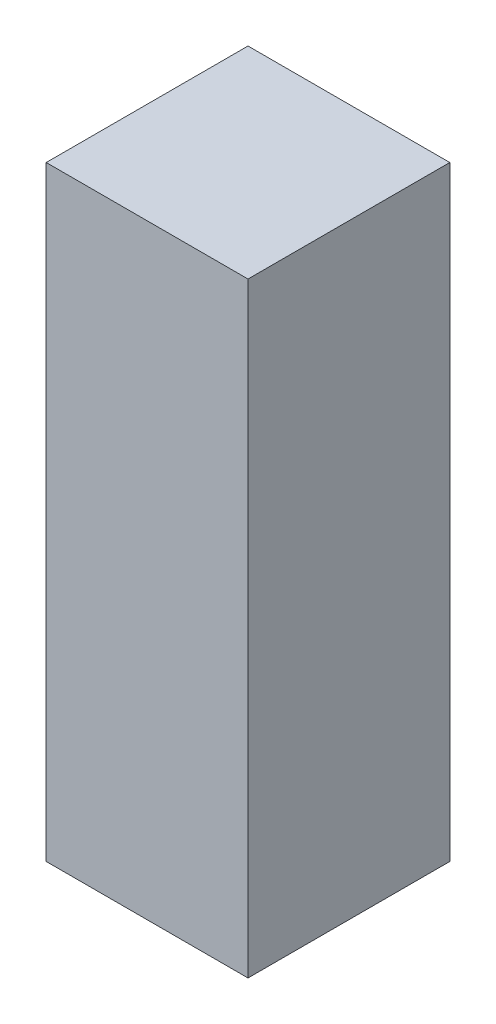
ISO-10303-21;
HEADER;
FILE_DESCRIPTION(('STEP AP214'),'2;1');
FILE_NAME('part.step','',(''),(''),'','','');
FILE_SCHEMA(('AUTOMOTIVE_DESIGN { 1 0 10303 214 1 1 1 1 }'));
ENDSEC;
DATA;
#1=APPLICATION_CONTEXT('core data for automotive mechanical design processes');
#2=APPLICATION_PROTOCOL_DEFINITION('international standard','automotive_design',2000,#1);
#3=PRODUCT_CONTEXT('',#1,'mechanical');
#4=PRODUCT('Part','Part','',(#3));
#5=PRODUCT_RELATED_PRODUCT_CATEGORY('part','',(#4));
#6=PRODUCT_DEFINITION_FORMATION('','',#4);
#7=PRODUCT_DEFINITION_CONTEXT('part definition',#1,'design');
#8=PRODUCT_DEFINITION('design','',#6,#7);
#9=PRODUCT_DEFINITION_SHAPE('','',#8);
#10=(LENGTH_UNIT() NAMED_UNIT(*) SI_UNIT(.MILLI.,.METRE.));
#11=(NAMED_UNIT(*) PLANE_ANGLE_UNIT() SI_UNIT($,.RADIAN.));
#12=(NAMED_UNIT(*) SI_UNIT($,.STERADIAN.) SOLID_ANGLE_UNIT());
#13=UNCERTAINTY_MEASURE_WITH_UNIT(LENGTH_MEASURE(1.E-05),#10,'distance_accuracy_value','');
#14=(GEOMETRIC_REPRESENTATION_CONTEXT(3) GLOBAL_UNCERTAINTY_ASSIGNED_CONTEXT((#13)) GLOBAL_UNIT_ASSIGNED_CONTEXT((#10,
#11,#12)) REPRESENTATION_CONTEXT('',''));
#15=CARTESIAN_POINT('',(0.,0.,0.));
#16=DIRECTION('',(0.,0.,1.));
#17=DIRECTION('',(1.,0.,0.));
#18=AXIS2_PLACEMENT_3D('',#15,#16,#17);
#19=CARTESIAN_POINT('',(-0.914015151515154,9.525,-1.13049242424243));
#20=DIRECTION('',(1.,0.,0.));
#21=DIRECTION('',(0.,0.,-1.));
#22=AXIS2_PLACEMENT_3D('',#19,#20,#21);
#23=PLANE('',#22);
#24=DIRECTION('',(0.,0.,1.));
#25=VECTOR('',#24,1.);
#26=CARTESIAN_POINT('',(-0.914015151515154,0.,-1.13049242424243));
#27=LINE('',#26,#25);
#28=CARTESIAN_POINT('',(-0.914015151515154,0.,-1.13049242424243));
#29=VERTEX_POINT('',#28);
#30=CARTESIAN_POINT('',(-0.914015151515154,0.,2.04450757575757));
#31=VERTEX_POINT('',#30);
#32=EDGE_CURVE('E97',#29,#31,#27,.T.);
#33=ORIENTED_EDGE('',*,*,#32,.T.);
#34=DIRECTION('',(0.,-1.,0.));
#35=VECTOR('',#34,1.);
#36=CARTESIAN_POINT('',(-0.914015151515154,9.525,2.04450757575757));
#37=LINE('',#36,#35);
#38=CARTESIAN_POINT('',(-0.914015151515154,9.525,2.04450757575757));
#39=VERTEX_POINT('',#38);
#40=EDGE_CURVE('E11',#39,#31,#37,.T.);
#41=ORIENTED_EDGE('',*,*,#40,.F.);
#42=DIRECTION('',(0.,0.,1.));
#43=VECTOR('',#42,1.);
#44=CARTESIAN_POINT('',(-0.914015151515154,9.525,-1.13049242424243));
#45=LINE('',#44,#43);
#46=CARTESIAN_POINT('',(-0.914015151515154,9.525,-1.13049242424243));
#47=VERTEX_POINT('',#46);
#48=EDGE_CURVE('E85',#47,#39,#45,.T.);
#49=ORIENTED_EDGE('',*,*,#48,.F.);
#50=DIRECTION('',(0.,-1.,0.));
#51=VECTOR('',#50,1.);
#52=CARTESIAN_POINT('',(-0.914015151515154,9.525,-1.13049242424243));
#53=LINE('',#52,#51);
#54=EDGE_CURVE('E93',#47,#29,#53,.T.);
#55=ORIENTED_EDGE('',*,*,#54,.T.);
#56=EDGE_LOOP('',(#33,#41,#49,#55));
#57=FACE_BOUND('',#56,.T.);
#58=ADVANCED_FACE('F34',(#57),#23,.F.);
#59=CARTESIAN_POINT('',(-0.914015151515154,9.525,2.04450757575757));
#60=DIRECTION('',(0.,0.,-1.));
#61=DIRECTION('',(-1.,0.,0.));
#62=AXIS2_PLACEMENT_3D('',#59,#60,#61);
#63=PLANE('',#62);
#64=DIRECTION('',(1.,0.,0.));
#65=VECTOR('',#64,1.);
#66=CARTESIAN_POINT('',(-0.914015151515154,0.,2.04450757575757));
#67=LINE('',#66,#65);
#68=CARTESIAN_POINT('',(2.26098484848485,0.,2.04450757575757));
#69=VERTEX_POINT('',#68);
#70=EDGE_CURVE('E89',#31,#69,#67,.T.);
#71=ORIENTED_EDGE('',*,*,#70,.T.);
#72=DIRECTION('',(0.,-1.,0.));
#73=VECTOR('',#72,1.);
#74=CARTESIAN_POINT('',(2.26098484848485,9.525,2.04450757575757));
#75=LINE('',#74,#73);
#76=CARTESIAN_POINT('',(2.26098484848485,9.525,2.04450757575757));
#77=VERTEX_POINT('',#76);
#78=EDGE_CURVE('E42',#77,#69,#75,.T.);
#79=ORIENTED_EDGE('',*,*,#78,.F.);
#80=DIRECTION('',(1.,0.,0.));
#81=VECTOR('',#80,1.);
#82=CARTESIAN_POINT('',(-0.914015151515154,9.525,2.04450757575757));
#83=LINE('',#82,#81);
#84=EDGE_CURVE('E80',#39,#77,#83,.T.);
#85=ORIENTED_EDGE('',*,*,#84,.F.);
#86=ORIENTED_EDGE('',*,*,#40,.T.);
#87=EDGE_LOOP('',(#71,#79,#85,#86));
#88=FACE_BOUND('',#87,.T.);
#89=ADVANCED_FACE('F88',(#88),#63,.F.);
#90=CARTESIAN_POINT('',(2.26098484848485,9.525,-1.13049242424243));
#91=DIRECTION('',(-1.,0.,0.));
#92=DIRECTION('',(0.,0.,1.));
#93=AXIS2_PLACEMENT_3D('',#90,#91,#92);
#94=PLANE('',#93);
#95=DIRECTION('',(0.,0.,-1.));
#96=VECTOR('',#95,1.);
#97=CARTESIAN_POINT('',(2.26098484848485,0.,-1.13049242424243));
#98=LINE('',#97,#96);
#99=CARTESIAN_POINT('',(2.26098484848485,0.,-1.13049242424243));
#100=VERTEX_POINT('',#99);
#101=EDGE_CURVE('E67',#69,#100,#98,.T.);
#102=ORIENTED_EDGE('',*,*,#101,.T.);
#103=DIRECTION('',(0.,-1.,0.));
#104=VECTOR('',#103,1.);
#105=CARTESIAN_POINT('',(2.26098484848485,9.525,-1.13049242424243));
#106=LINE('',#105,#104);
#107=CARTESIAN_POINT('',(2.26098484848485,9.525,-1.13049242424243));
#108=VERTEX_POINT('',#107);
#109=EDGE_CURVE('E90',#108,#100,#106,.T.);
#110=ORIENTED_EDGE('',*,*,#109,.F.);
#111=DIRECTION('',(0.,0.,-1.));
#112=VECTOR('',#111,1.);
#113=CARTESIAN_POINT('',(2.26098484848485,9.525,-1.13049242424243));
#114=LINE('',#113,#112);
#115=EDGE_CURVE('E83',#77,#108,#114,.T.);
#116=ORIENTED_EDGE('',*,*,#115,.F.);
#117=ORIENTED_EDGE('',*,*,#78,.T.);
#118=EDGE_LOOP('',(#102,#110,#116,#117));
#119=FACE_BOUND('',#118,.T.);
#120=ADVANCED_FACE('F91',(#119),#94,.F.);
#121=CARTESIAN_POINT('',(-0.914015151515154,9.525,-1.13049242424243));
#122=DIRECTION('',(0.,0.,1.));
#123=DIRECTION('',(1.,0.,0.));
#124=AXIS2_PLACEMENT_3D('',#121,#122,#123);
#125=PLANE('',#124);
#126=DIRECTION('',(-1.,0.,0.));
#127=VECTOR('',#126,1.);
#128=CARTESIAN_POINT('',(-0.914015151515154,0.,-1.13049242424243));
#129=LINE('',#128,#127);
#130=EDGE_CURVE('E73',#100,#29,#129,.T.);
#131=ORIENTED_EDGE('',*,*,#130,.T.);
#132=ORIENTED_EDGE('',*,*,#54,.F.);
#133=DIRECTION('',(-1.,0.,0.));
#134=VECTOR('',#133,1.);
#135=CARTESIAN_POINT('',(-0.914015151515154,9.525,-1.13049242424243));
#136=LINE('',#135,#134);
#137=EDGE_CURVE('E50',#108,#47,#136,.T.);
#138=ORIENTED_EDGE('',*,*,#137,.F.);
#139=ORIENTED_EDGE('',*,*,#109,.T.);
#140=EDGE_LOOP('',(#131,#132,#138,#139));
#141=FACE_BOUND('',#140,.T.);
#142=ADVANCED_FACE('F104',(#141),#125,.F.);
#143=CARTESIAN_POINT('',(0.,9.525,0.));
#144=DIRECTION('',(0.,1.,0.));
#145=DIRECTION('',(0.,0.,1.));
#146=AXIS2_PLACEMENT_3D('',#143,#144,#145);
#147=PLANE('',#146);
#148=ORIENTED_EDGE('',*,*,#48,.T.);
#149=ORIENTED_EDGE('',*,*,#84,.T.);
#150=ORIENTED_EDGE('',*,*,#115,.T.);
#151=ORIENTED_EDGE('',*,*,#137,.T.);
#152=EDGE_LOOP('',(#148,#149,#150,#151));
#153=FACE_BOUND('',#152,.T.);
#154=ADVANCED_FACE('F81',(#153),#147,.T.);
#155=CARTESIAN_POINT('',(0.,0.,0.));
#156=DIRECTION('',(0.,1.,0.));
#157=DIRECTION('',(0.,0.,1.));
#158=AXIS2_PLACEMENT_3D('',#155,#156,#157);
#159=PLANE('',#158);
#160=ORIENTED_EDGE('',*,*,#32,.F.);
#161=ORIENTED_EDGE('',*,*,#130,.F.);
#162=ORIENTED_EDGE('',*,*,#101,.F.);
#163=ORIENTED_EDGE('',*,*,#70,.F.);
#164=EDGE_LOOP('',(#160,#161,#162,#163));
#165=FACE_BOUND('',#164,.T.);
#166=ADVANCED_FACE('F107',(#165),#159,.F.);
#167=CLOSED_SHELL('',(#58,#89,#120,#142,#154,#166));
#168=MANIFOLD_SOLID_BREP('B2',#167);
#169=ADVANCED_BREP_SHAPE_REPRESENTATION('',(#18,#168),#14);
#170=SHAPE_DEFINITION_REPRESENTATION(#9,#169);
ENDSEC;
END-ISO-10303-21;
